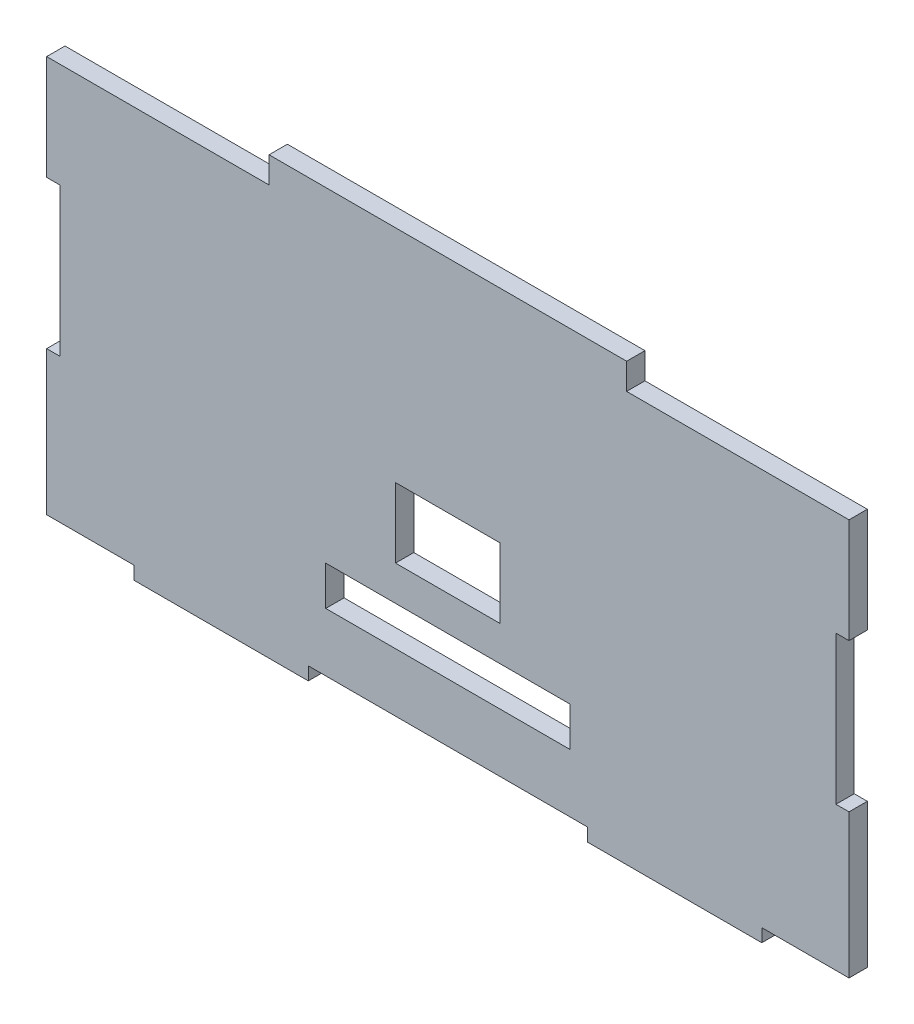
ISO-10303-21;
HEADER;
FILE_DESCRIPTION(('STEP AP214'),'2;1');
FILE_NAME('part.step','',(''),(''),'','','');
FILE_SCHEMA(('AUTOMOTIVE_DESIGN { 1 0 10303 214 1 1 1 1 }'));
ENDSEC;
DATA;
#1=APPLICATION_CONTEXT('core data for automotive mechanical design processes');
#2=APPLICATION_PROTOCOL_DEFINITION('international standard','automotive_design',2000,#1);
#3=PRODUCT_CONTEXT('',#1,'mechanical');
#4=PRODUCT('Part','Part','',(#3));
#5=PRODUCT_RELATED_PRODUCT_CATEGORY('part','',(#4));
#6=PRODUCT_DEFINITION_FORMATION('','',#4);
#7=PRODUCT_DEFINITION_CONTEXT('part definition',#1,'design');
#8=PRODUCT_DEFINITION('design','',#6,#7);
#9=PRODUCT_DEFINITION_SHAPE('','',#8);
#10=(LENGTH_UNIT() NAMED_UNIT(*) SI_UNIT(.MILLI.,.METRE.));
#11=(NAMED_UNIT(*) PLANE_ANGLE_UNIT() SI_UNIT($,.RADIAN.));
#12=(NAMED_UNIT(*) SI_UNIT($,.STERADIAN.) SOLID_ANGLE_UNIT());
#13=UNCERTAINTY_MEASURE_WITH_UNIT(LENGTH_MEASURE(1.E-05),#10,'distance_accuracy_value','');
#14=(GEOMETRIC_REPRESENTATION_CONTEXT(3) GLOBAL_UNCERTAINTY_ASSIGNED_CONTEXT((#13)) GLOBAL_UNIT_ASSIGNED_CONTEXT((#10,
#11,#12)) REPRESENTATION_CONTEXT('',''));
#15=CARTESIAN_POINT('',(0.,0.,0.));
#16=DIRECTION('',(0.,0.,1.));
#17=DIRECTION('',(1.,0.,0.));
#18=AXIS2_PLACEMENT_3D('',#15,#16,#17);
#19=CARTESIAN_POINT('',(46.,-23.5,-2.1));
#20=DIRECTION('',(1.,0.,0.));
#21=DIRECTION('',(0.,0.,-1.));
#22=AXIS2_PLACEMENT_3D('',#19,#20,#21);
#23=PLANE('',#22);
#24=DIRECTION('',(0.,0.,1.));
#25=VECTOR('',#24,1.);
#26=CARTESIAN_POINT('',(46.,-5.50000000000001,-2.1));
#27=LINE('',#26,#25);
#28=CARTESIAN_POINT('',(46.,-5.50000000000001,-2.1));
#29=VERTEX_POINT('',#28);
#30=CARTESIAN_POINT('',(46.,-5.50000000000001,0.));
#31=VERTEX_POINT('',#30);
#32=EDGE_CURVE('E502',#29,#31,#27,.T.);
#33=ORIENTED_EDGE('',*,*,#32,.T.);
#34=DIRECTION('',(0.,1.,0.));
#35=VECTOR('',#34,1.);
#36=CARTESIAN_POINT('',(46.,-23.5,0.));
#37=LINE('',#36,#35);
#38=CARTESIAN_POINT('',(46.,-22.,0.));
#39=VERTEX_POINT('',#38);
#40=EDGE_CURVE('E294',#39,#31,#37,.T.);
#41=ORIENTED_EDGE('',*,*,#40,.F.);
#42=DIRECTION('',(0.,0.,1.));
#43=VECTOR('',#42,1.);
#44=CARTESIAN_POINT('',(46.,-22.,-2.1));
#45=LINE('',#44,#43);
#46=CARTESIAN_POINT('',(46.,-22.,-2.1));
#47=VERTEX_POINT('',#46);
#48=EDGE_CURVE('E62',#47,#39,#45,.T.);
#49=ORIENTED_EDGE('',*,*,#48,.F.);
#50=DIRECTION('',(0.,1.,0.));
#51=VECTOR('',#50,1.);
#52=CARTESIAN_POINT('',(46.,-23.5,-2.1));
#53=LINE('',#52,#51);
#54=EDGE_CURVE('E305',#47,#29,#53,.T.);
#55=ORIENTED_EDGE('',*,*,#54,.T.);
#56=EDGE_LOOP('',(#33,#41,#49,#55));
#57=FACE_BOUND('',#56,.T.);
#58=ADVANCED_FACE('F37',(#57),#23,.T.);
#59=CARTESIAN_POINT('',(-46.,-23.5,-2.1));
#60=DIRECTION('',(0.,-1.,0.));
#61=DIRECTION('',(0.,0.,-1.));
#62=AXIS2_PLACEMENT_3D('',#59,#60,#61);
#63=PLANE('',#62);
#64=DIRECTION('',(0.,0.,1.));
#65=VECTOR('',#64,1.);
#66=CARTESIAN_POINT('',(-16.,-23.5,-2.1));
#67=LINE('',#66,#65);
#68=CARTESIAN_POINT('',(-16.,-23.5,-2.1));
#69=VERTEX_POINT('',#68);
#70=CARTESIAN_POINT('',(-16.,-23.5,0.));
#71=VERTEX_POINT('',#70);
#72=EDGE_CURVE('E454',#69,#71,#67,.T.);
#73=ORIENTED_EDGE('',*,*,#72,.T.);
#74=DIRECTION('',(1.,0.,0.));
#75=VECTOR('',#74,1.);
#76=CARTESIAN_POINT('',(-46.,-23.5,0.));
#77=LINE('',#76,#75);
#78=CARTESIAN_POINT('',(-36.,-23.5,0.));
#79=VERTEX_POINT('',#78);
#80=EDGE_CURVE('E292',#79,#71,#77,.T.);
#81=ORIENTED_EDGE('',*,*,#80,.F.);
#82=DIRECTION('',(0.,0.,1.));
#83=VECTOR('',#82,1.);
#84=CARTESIAN_POINT('',(-36.,-23.5,-2.1));
#85=LINE('',#84,#83);
#86=CARTESIAN_POINT('',(-36.,-23.5,-2.1));
#87=VERTEX_POINT('',#86);
#88=EDGE_CURVE('E456',#87,#79,#85,.T.);
#89=ORIENTED_EDGE('',*,*,#88,.F.);
#90=DIRECTION('',(1.,0.,0.));
#91=VECTOR('',#90,1.);
#92=CARTESIAN_POINT('',(-46.,-23.5,-2.1));
#93=LINE('',#92,#91);
#94=EDGE_CURVE('E315',#87,#69,#93,.T.);
#95=ORIENTED_EDGE('',*,*,#94,.T.);
#96=EDGE_LOOP('',(#73,#81,#89,#95));
#97=FACE_BOUND('',#96,.T.);
#98=ADVANCED_FACE('F452',(#97),#63,.T.);
#99=CARTESIAN_POINT('',(-46.,-23.5,-2.1));
#100=DIRECTION('',(-1.,0.,0.));
#101=DIRECTION('',(0.,0.,1.));
#102=AXIS2_PLACEMENT_3D('',#99,#100,#101);
#103=PLANE('',#102);
#104=DIRECTION('',(0.,0.,1.));
#105=VECTOR('',#104,1.);
#106=CARTESIAN_POINT('',(-46.,11.5,-2.1));
#107=LINE('',#106,#105);
#108=CARTESIAN_POINT('',(-46.,11.5,-2.1));
#109=VERTEX_POINT('',#108);
#110=CARTESIAN_POINT('',(-46.,11.5,0.));
#111=VERTEX_POINT('',#110);
#112=EDGE_CURVE('E348',#109,#111,#107,.T.);
#113=ORIENTED_EDGE('',*,*,#112,.T.);
#114=DIRECTION('',(0.,-1.,0.));
#115=VECTOR('',#114,1.);
#116=CARTESIAN_POINT('',(-46.,-23.5,0.));
#117=LINE('',#116,#115);
#118=CARTESIAN_POINT('',(-46.,23.5,0.));
#119=VERTEX_POINT('',#118);
#120=EDGE_CURVE('E280',#119,#111,#117,.T.);
#121=ORIENTED_EDGE('',*,*,#120,.F.);
#122=DIRECTION('',(0.,0.,1.));
#123=VECTOR('',#122,1.);
#124=CARTESIAN_POINT('',(-46.,23.5,-2.1));
#125=LINE('',#124,#123);
#126=CARTESIAN_POINT('',(-46.,23.5,-2.1));
#127=VERTEX_POINT('',#126);
#128=EDGE_CURVE('E46',#127,#119,#125,.T.);
#129=ORIENTED_EDGE('',*,*,#128,.F.);
#130=DIRECTION('',(0.,-1.,0.));
#131=VECTOR('',#130,1.);
#132=CARTESIAN_POINT('',(-46.,-23.5,-2.1));
#133=LINE('',#132,#131);
#134=EDGE_CURVE('E441',#127,#109,#133,.T.);
#135=ORIENTED_EDGE('',*,*,#134,.T.);
#136=EDGE_LOOP('',(#113,#121,#129,#135));
#137=FACE_BOUND('',#136,.T.);
#138=ADVANCED_FACE('F347',(#137),#103,.T.);
#139=CARTESIAN_POINT('',(20.5,23.5,-2.1));
#140=DIRECTION('',(0.,1.,0.));
#141=DIRECTION('',(-1.,0.,0.));
#142=AXIS2_PLACEMENT_3D('',#139,#140,#141);
#143=PLANE('',#142);
#144=DIRECTION('',(-1.,0.,0.));
#145=VECTOR('',#144,1.);
#146=CARTESIAN_POINT('',(20.5,23.5,0.));
#147=LINE('',#146,#145);
#148=CARTESIAN_POINT('',(46.,23.5,0.));
#149=VERTEX_POINT('',#148);
#150=CARTESIAN_POINT('',(20.5,23.5,0.));
#151=VERTEX_POINT('',#150);
#152=EDGE_CURVE('E320',#149,#151,#147,.T.);
#153=ORIENTED_EDGE('',*,*,#152,.F.);
#154=DIRECTION('',(0.,0.,1.));
#155=VECTOR('',#154,1.);
#156=CARTESIAN_POINT('',(46.,23.5,-2.1));
#157=LINE('',#156,#155);
#158=CARTESIAN_POINT('',(46.,23.5,-2.1));
#159=VERTEX_POINT('',#158);
#160=EDGE_CURVE('E11',#159,#149,#157,.T.);
#161=ORIENTED_EDGE('',*,*,#160,.F.);
#162=DIRECTION('',(-1.,0.,0.));
#163=VECTOR('',#162,1.);
#164=CARTESIAN_POINT('',(20.5,23.5,-2.1));
#165=LINE('',#164,#163);
#166=CARTESIAN_POINT('',(20.5,23.5,-2.1));
#167=VERTEX_POINT('',#166);
#168=EDGE_CURVE('E433',#159,#167,#165,.T.);
#169=ORIENTED_EDGE('',*,*,#168,.T.);
#170=DIRECTION('',(0.,0.,1.));
#171=VECTOR('',#170,1.);
#172=CARTESIAN_POINT('',(20.5,23.5,-2.1));
#173=LINE('',#172,#171);
#174=EDGE_CURVE('E41',#167,#151,#173,.T.);
#175=ORIENTED_EDGE('',*,*,#174,.T.);
#176=EDGE_LOOP('',(#153,#161,#169,#175));
#177=FACE_BOUND('',#176,.T.);
#178=ADVANCED_FACE('F39',(#177),#143,.T.);
#179=DIRECTION('',(0.,0.,1.));
#180=VECTOR('',#179,1.);
#181=CARTESIAN_POINT('',(46.,11.5,-2.1));
#182=LINE('',#181,#180);
#183=CARTESIAN_POINT('',(46.,11.5,-2.1));
#184=VERTEX_POINT('',#183);
#185=CARTESIAN_POINT('',(46.,11.5,0.));
#186=VERTEX_POINT('',#185);
#187=EDGE_CURVE('E54',#184,#186,#182,.T.);
#188=ORIENTED_EDGE('',*,*,#187,.F.);
#189=EDGE_CURVE('E310',#184,#159,#53,.T.);
#190=ORIENTED_EDGE('',*,*,#189,.T.);
#191=ORIENTED_EDGE('',*,*,#160,.T.);
#192=EDGE_CURVE('E293',#186,#149,#37,.T.);
#193=ORIENTED_EDGE('',*,*,#192,.F.);
#194=EDGE_LOOP('',(#188,#190,#191,#193));
#195=FACE_BOUND('',#194,.T.);
#196=ADVANCED_FACE('F565',(#195),#23,.T.);
#197=DIRECTION('',(0.,0.,1.));
#198=VECTOR('',#197,1.);
#199=CARTESIAN_POINT('',(36.,-23.5,-2.1));
#200=LINE('',#199,#198);
#201=CARTESIAN_POINT('',(36.,-23.5,-2.1));
#202=VERTEX_POINT('',#201);
#203=CARTESIAN_POINT('',(36.,-23.5,0.));
#204=VERTEX_POINT('',#203);
#205=EDGE_CURVE('E484',#202,#204,#200,.T.);
#206=ORIENTED_EDGE('',*,*,#205,.T.);
#207=CARTESIAN_POINT('',(16.,-23.5,0.));
#208=VERTEX_POINT('',#207);
#209=EDGE_CURVE('E284',#208,#204,#77,.T.);
#210=ORIENTED_EDGE('',*,*,#209,.F.);
#211=DIRECTION('',(0.,0.,1.));
#212=VECTOR('',#211,1.);
#213=CARTESIAN_POINT('',(16.,-23.5,-2.1));
#214=LINE('',#213,#212);
#215=CARTESIAN_POINT('',(16.,-23.5,-2.1));
#216=VERTEX_POINT('',#215);
#217=EDGE_CURVE('E469',#216,#208,#214,.T.);
#218=ORIENTED_EDGE('',*,*,#217,.F.);
#219=EDGE_CURVE('E318',#216,#202,#93,.T.);
#220=ORIENTED_EDGE('',*,*,#219,.T.);
#221=EDGE_LOOP('',(#206,#210,#218,#220));
#222=FACE_BOUND('',#221,.T.);
#223=ADVANCED_FACE('F543',(#222),#63,.T.);
#224=DIRECTION('',(0.,0.,1.));
#225=VECTOR('',#224,1.);
#226=CARTESIAN_POINT('',(-46.,-22.,-2.1));
#227=LINE('',#226,#225);
#228=CARTESIAN_POINT('',(-46.,-22.,-2.1));
#229=VERTEX_POINT('',#228);
#230=CARTESIAN_POINT('',(-46.,-22.,0.));
#231=VERTEX_POINT('',#230);
#232=EDGE_CURVE('E253',#229,#231,#227,.T.);
#233=ORIENTED_EDGE('',*,*,#232,.T.);
#234=CARTESIAN_POINT('',(-46.,-5.50000000000001,0.));
#235=VERTEX_POINT('',#234);
#236=EDGE_CURVE('E268',#235,#231,#117,.T.);
#237=ORIENTED_EDGE('',*,*,#236,.F.);
#238=DIRECTION('',(0.,0.,1.));
#239=VECTOR('',#238,1.);
#240=CARTESIAN_POINT('',(-46.,-5.50000000000001,-2.1));
#241=LINE('',#240,#239);
#242=CARTESIAN_POINT('',(-46.,-5.50000000000001,-2.1));
#243=VERTEX_POINT('',#242);
#244=EDGE_CURVE('E368',#243,#235,#241,.T.);
#245=ORIENTED_EDGE('',*,*,#244,.F.);
#246=EDGE_CURVE('E270',#243,#229,#133,.T.);
#247=ORIENTED_EDGE('',*,*,#246,.T.);
#248=EDGE_LOOP('',(#233,#237,#245,#247));
#249=FACE_BOUND('',#248,.T.);
#250=ADVANCED_FACE('F266',(#249),#103,.T.);
#251=CARTESIAN_POINT('',(-46.,23.5,-2.1));
#252=DIRECTION('',(0.,1.,0.));
#253=DIRECTION('',(0.,0.,1.));
#254=AXIS2_PLACEMENT_3D('',#251,#252,#253);
#255=PLANE('',#254);
#256=DIRECTION('',(-1.,0.,0.));
#257=VECTOR('',#256,1.);
#258=CARTESIAN_POINT('',(-46.,23.5,0.));
#259=LINE('',#258,#257);
#260=CARTESIAN_POINT('',(-20.5,23.5,0.));
#261=VERTEX_POINT('',#260);
#262=EDGE_CURVE('E281',#261,#119,#259,.T.);
#263=ORIENTED_EDGE('',*,*,#262,.F.);
#264=DIRECTION('',(0.,0.,1.));
#265=VECTOR('',#264,1.);
#266=CARTESIAN_POINT('',(-20.5,23.5,-2.1));
#267=LINE('',#266,#265);
#268=CARTESIAN_POINT('',(-20.5,23.5,-2.1));
#269=VERTEX_POINT('',#268);
#270=EDGE_CURVE('E297',#269,#261,#267,.T.);
#271=ORIENTED_EDGE('',*,*,#270,.F.);
#272=DIRECTION('',(-1.,0.,0.));
#273=VECTOR('',#272,1.);
#274=CARTESIAN_POINT('',(-46.,23.5,-2.1));
#275=LINE('',#274,#273);
#276=EDGE_CURVE('E342',#269,#127,#275,.T.);
#277=ORIENTED_EDGE('',*,*,#276,.T.);
#278=ORIENTED_EDGE('',*,*,#128,.T.);
#279=EDGE_LOOP('',(#263,#271,#277,#278));
#280=FACE_BOUND('',#279,.T.);
#281=ADVANCED_FACE('F340',(#280),#255,.T.);
#282=CARTESIAN_POINT('',(-20.5,23.5,-2.1));
#283=DIRECTION('',(-1.,0.,0.));
#284=DIRECTION('',(0.,0.,1.));
#285=AXIS2_PLACEMENT_3D('',#282,#283,#284);
#286=PLANE('',#285);
#287=DIRECTION('',(0.,-1.,0.));
#288=VECTOR('',#287,1.);
#289=CARTESIAN_POINT('',(-20.5,23.5,0.));
#290=LINE('',#289,#288);
#291=CARTESIAN_POINT('',(-20.5,26.5,0.));
#292=VERTEX_POINT('',#291);
#293=EDGE_CURVE('E286',#292,#261,#290,.T.);
#294=ORIENTED_EDGE('',*,*,#293,.F.);
#295=DIRECTION('',(0.,0.,1.));
#296=VECTOR('',#295,1.);
#297=CARTESIAN_POINT('',(-20.5,26.5,-2.1));
#298=LINE('',#297,#296);
#299=CARTESIAN_POINT('',(-20.5,26.5,-2.1));
#300=VERTEX_POINT('',#299);
#301=EDGE_CURVE('E299',#300,#292,#298,.T.);
#302=ORIENTED_EDGE('',*,*,#301,.F.);
#303=DIRECTION('',(0.,-1.,0.));
#304=VECTOR('',#303,1.);
#305=CARTESIAN_POINT('',(-20.5,23.5,-2.1));
#306=LINE('',#305,#304);
#307=EDGE_CURVE('E336',#300,#269,#306,.T.);
#308=ORIENTED_EDGE('',*,*,#307,.T.);
#309=ORIENTED_EDGE('',*,*,#270,.T.);
#310=EDGE_LOOP('',(#294,#302,#308,#309));
#311=FACE_BOUND('',#310,.T.);
#312=ADVANCED_FACE('F333',(#311),#286,.T.);
#313=CARTESIAN_POINT('',(-20.5,26.5,-2.1));
#314=DIRECTION('',(0.,1.,0.));
#315=DIRECTION('',(0.,0.,1.));
#316=AXIS2_PLACEMENT_3D('',#313,#314,#315);
#317=PLANE('',#316);
#318=DIRECTION('',(-1.,0.,0.));
#319=VECTOR('',#318,1.);
#320=CARTESIAN_POINT('',(-20.5,26.5,0.));
#321=LINE('',#320,#319);
#322=CARTESIAN_POINT('',(20.5,26.5,0.));
#323=VERTEX_POINT('',#322);
#324=EDGE_CURVE('E327',#323,#292,#321,.T.);
#325=ORIENTED_EDGE('',*,*,#324,.F.);
#326=DIRECTION('',(0.,0.,1.));
#327=VECTOR('',#326,1.);
#328=CARTESIAN_POINT('',(20.5,26.5,-2.1));
#329=LINE('',#328,#327);
#330=CARTESIAN_POINT('',(20.5,26.5,-2.1));
#331=VERTEX_POINT('',#330);
#332=EDGE_CURVE('E300',#331,#323,#329,.T.);
#333=ORIENTED_EDGE('',*,*,#332,.F.);
#334=DIRECTION('',(-1.,0.,0.));
#335=VECTOR('',#334,1.);
#336=CARTESIAN_POINT('',(-20.5,26.5,-2.1));
#337=LINE('',#336,#335);
#338=EDGE_CURVE('E437',#331,#300,#337,.T.);
#339=ORIENTED_EDGE('',*,*,#338,.T.);
#340=ORIENTED_EDGE('',*,*,#301,.T.);
#341=EDGE_LOOP('',(#325,#333,#339,#340));
#342=FACE_BOUND('',#341,.T.);
#343=ADVANCED_FACE('F858',(#342),#317,.T.);
#344=CARTESIAN_POINT('',(20.5,26.5,-2.1));
#345=DIRECTION('',(1.,0.,0.));
#346=DIRECTION('',(0.,0.,-1.));
#347=AXIS2_PLACEMENT_3D('',#344,#345,#346);
#348=PLANE('',#347);
#349=DIRECTION('',(0.,1.,0.));
#350=VECTOR('',#349,1.);
#351=CARTESIAN_POINT('',(20.5,26.5,0.));
#352=LINE('',#351,#350);
#353=EDGE_CURVE('E323',#151,#323,#352,.T.);
#354=ORIENTED_EDGE('',*,*,#353,.F.);
#355=ORIENTED_EDGE('',*,*,#174,.F.);
#356=DIRECTION('',(0.,1.,0.));
#357=VECTOR('',#356,1.);
#358=CARTESIAN_POINT('',(20.5,26.5,-2.1));
#359=LINE('',#358,#357);
#360=EDGE_CURVE('E435',#167,#331,#359,.T.);
#361=ORIENTED_EDGE('',*,*,#360,.T.);
#362=ORIENTED_EDGE('',*,*,#332,.T.);
#363=EDGE_LOOP('',(#354,#355,#361,#362));
#364=FACE_BOUND('',#363,.T.);
#365=ADVANCED_FACE('F638',(#364),#348,.T.);
#366=CARTESIAN_POINT('',(0.,0.,-2.1));
#367=DIRECTION('',(0.,0.,1.));
#368=DIRECTION('',(1.,0.,0.));
#369=AXIS2_PLACEMENT_3D('',#366,#367,#368);
#370=PLANE('',#369);
#371=DIRECTION('',(1.,0.,0.));
#372=VECTOR('',#371,1.);
#373=CARTESIAN_POINT('',(-14.,-15.3,-2.1));
#374=LINE('',#373,#372);
#375=CARTESIAN_POINT('',(-14.,-15.3,-2.1));
#376=VERTEX_POINT('',#375);
#377=CARTESIAN_POINT('',(14.,-15.3,-2.1));
#378=VERTEX_POINT('',#377);
#379=EDGE_CURVE('E381',#376,#378,#374,.T.);
#380=ORIENTED_EDGE('',*,*,#379,.T.);
#381=DIRECTION('',(0.,1.,0.));
#382=VECTOR('',#381,1.);
#383=CARTESIAN_POINT('',(14.,-15.3,-2.1));
#384=LINE('',#383,#382);
#385=CARTESIAN_POINT('',(14.,-10.8,-2.1));
#386=VERTEX_POINT('',#385);
#387=EDGE_CURVE('E371',#378,#386,#384,.T.);
#388=ORIENTED_EDGE('',*,*,#387,.T.);
#389=DIRECTION('',(-1.,0.,0.));
#390=VECTOR('',#389,1.);
#391=CARTESIAN_POINT('',(-14.,-10.8,-2.1));
#392=LINE('',#391,#390);
#393=CARTESIAN_POINT('',(-14.,-10.8,-2.1));
#394=VERTEX_POINT('',#393);
#395=EDGE_CURVE('E374',#386,#394,#392,.T.);
#396=ORIENTED_EDGE('',*,*,#395,.T.);
#397=DIRECTION('',(0.,-1.,0.));
#398=VECTOR('',#397,1.);
#399=CARTESIAN_POINT('',(-14.,-15.3,-2.1));
#400=LINE('',#399,#398);
#401=EDGE_CURVE('E378',#394,#376,#400,.T.);
#402=ORIENTED_EDGE('',*,*,#401,.T.);
#403=EDGE_LOOP('',(#380,#388,#396,#402));
#404=FACE_BOUND('',#403,.T.);
#405=DIRECTION('',(1.,0.,0.));
#406=VECTOR('',#405,1.);
#407=CARTESIAN_POINT('',(-6.00000000000001,-6.8,-2.1));
#408=LINE('',#407,#406);
#409=CARTESIAN_POINT('',(-6.00000000000001,-6.8,-2.1));
#410=VERTEX_POINT('',#409);
#411=CARTESIAN_POINT('',(6.,-6.8,-2.1));
#412=VERTEX_POINT('',#411);
#413=EDGE_CURVE('E406',#410,#412,#408,.T.);
#414=ORIENTED_EDGE('',*,*,#413,.T.);
#415=DIRECTION('',(0.,1.,0.));
#416=VECTOR('',#415,1.);
#417=CARTESIAN_POINT('',(6.,-6.8,-2.1));
#418=LINE('',#417,#416);
#419=CARTESIAN_POINT('',(6.,1.2,-2.1));
#420=VERTEX_POINT('',#419);
#421=EDGE_CURVE('E416',#412,#420,#418,.T.);
#422=ORIENTED_EDGE('',*,*,#421,.T.);
#423=DIRECTION('',(-1.,0.,0.));
#424=VECTOR('',#423,1.);
#425=CARTESIAN_POINT('',(-6.00000000000001,1.2,-2.1));
#426=LINE('',#425,#424);
#427=CARTESIAN_POINT('',(-6.00000000000001,1.2,-2.1));
#428=VERTEX_POINT('',#427);
#429=EDGE_CURVE('E428',#420,#428,#426,.T.);
#430=ORIENTED_EDGE('',*,*,#429,.T.);
#431=DIRECTION('',(0.,-1.,0.));
#432=VECTOR('',#431,1.);
#433=CARTESIAN_POINT('',(-6.00000000000001,-6.8,-2.1));
#434=LINE('',#433,#432);
#435=EDGE_CURVE('E425',#428,#410,#434,.T.);
#436=ORIENTED_EDGE('',*,*,#435,.T.);
#437=EDGE_LOOP('',(#414,#422,#430,#436));
#438=FACE_BOUND('',#437,.T.);
#439=DIRECTION('',(0.,-1.,0.));
#440=VECTOR('',#439,1.);
#441=CARTESIAN_POINT('',(44.5,11.5,-2.1));
#442=LINE('',#441,#440);
#443=CARTESIAN_POINT('',(44.5,11.5,-2.1));
#444=VERTEX_POINT('',#443);
#445=CARTESIAN_POINT('',(44.5,-5.50000000000001,-2.1));
#446=VERTEX_POINT('',#445);
#447=EDGE_CURVE('E513',#444,#446,#442,.T.);
#448=ORIENTED_EDGE('',*,*,#447,.T.);
#449=DIRECTION('',(1.,0.,0.));
#450=VECTOR('',#449,1.);
#451=CARTESIAN_POINT('',(44.5,-5.50000000000001,-2.1));
#452=LINE('',#451,#450);
#453=EDGE_CURVE('E497',#446,#29,#452,.T.);
#454=ORIENTED_EDGE('',*,*,#453,.T.);
#455=ORIENTED_EDGE('',*,*,#54,.F.);
#456=DIRECTION('',(-1.,0.,0.));
#457=VECTOR('',#456,1.);
#458=CARTESIAN_POINT('',(36.,-22.,-2.1));
#459=LINE('',#458,#457);
#460=CARTESIAN_POINT('',(36.,-22.,-2.1));
#461=VERTEX_POINT('',#460);
#462=EDGE_CURVE('E490',#47,#461,#459,.T.);
#463=ORIENTED_EDGE('',*,*,#462,.T.);
#464=DIRECTION('',(0.,-1.,0.));
#465=VECTOR('',#464,1.);
#466=CARTESIAN_POINT('',(36.,-23.5,-2.1));
#467=LINE('',#466,#465);
#468=EDGE_CURVE('E481',#461,#202,#467,.T.);
#469=ORIENTED_EDGE('',*,*,#468,.T.);
#470=ORIENTED_EDGE('',*,*,#219,.F.);
#471=DIRECTION('',(0.,1.,0.));
#472=VECTOR('',#471,1.);
#473=CARTESIAN_POINT('',(16.,-22.,-2.1));
#474=LINE('',#473,#472);
#475=CARTESIAN_POINT('',(16.,-22.,-2.1));
#476=VERTEX_POINT('',#475);
#477=EDGE_CURVE('E471',#216,#476,#474,.T.);
#478=ORIENTED_EDGE('',*,*,#477,.T.);
#479=DIRECTION('',(-1.,0.,0.));
#480=VECTOR('',#479,1.);
#481=CARTESIAN_POINT('',(-16.,-22.,-2.1));
#482=LINE('',#481,#480);
#483=CARTESIAN_POINT('',(-16.,-22.,-2.1));
#484=VERTEX_POINT('',#483);
#485=EDGE_CURVE('E467',#476,#484,#482,.T.);
#486=ORIENTED_EDGE('',*,*,#485,.T.);
#487=DIRECTION('',(0.,-1.,0.));
#488=VECTOR('',#487,1.);
#489=CARTESIAN_POINT('',(-16.,-23.5,-2.1));
#490=LINE('',#489,#488);
#491=EDGE_CURVE('E464',#484,#69,#490,.T.);
#492=ORIENTED_EDGE('',*,*,#491,.T.);
#493=ORIENTED_EDGE('',*,*,#94,.F.);
#494=DIRECTION('',(0.,1.,0.));
#495=VECTOR('',#494,1.);
#496=CARTESIAN_POINT('',(-36.,-22.,-2.1));
#497=LINE('',#496,#495);
#498=CARTESIAN_POINT('',(-36.,-22.,-2.1));
#499=VERTEX_POINT('',#498);
#500=EDGE_CURVE('E261',#87,#499,#497,.T.);
#501=ORIENTED_EDGE('',*,*,#500,.T.);
#502=DIRECTION('',(-1.,0.,0.));
#503=VECTOR('',#502,1.);
#504=CARTESIAN_POINT('',(-46.,-22.,-2.1));
#505=LINE('',#504,#503);
#506=EDGE_CURVE('E524',#499,#229,#505,.T.);
#507=ORIENTED_EDGE('',*,*,#506,.T.);
#508=ORIENTED_EDGE('',*,*,#246,.F.);
#509=DIRECTION('',(1.,0.,0.));
#510=VECTOR('',#509,1.);
#511=CARTESIAN_POINT('',(-44.5,-5.50000000000001,-2.1));
#512=LINE('',#511,#510);
#513=CARTESIAN_POINT('',(-44.5,-5.50000000000001,-2.1));
#514=VERTEX_POINT('',#513);
#515=EDGE_CURVE('E354',#243,#514,#512,.T.);
#516=ORIENTED_EDGE('',*,*,#515,.T.);
#517=DIRECTION('',(0.,1.,0.));
#518=VECTOR('',#517,1.);
#519=CARTESIAN_POINT('',(-44.5,11.5,-2.1));
#520=LINE('',#519,#518);
#521=CARTESIAN_POINT('',(-44.5,11.5,-2.1));
#522=VERTEX_POINT('',#521);
#523=EDGE_CURVE('E357',#514,#522,#520,.T.);
#524=ORIENTED_EDGE('',*,*,#523,.T.);
#525=DIRECTION('',(-1.,0.,0.));
#526=VECTOR('',#525,1.);
#527=CARTESIAN_POINT('',(-46.,11.5,-2.1));
#528=LINE('',#527,#526);
#529=EDGE_CURVE('E370',#522,#109,#528,.T.);
#530=ORIENTED_EDGE('',*,*,#529,.T.);
#531=ORIENTED_EDGE('',*,*,#134,.F.);
#532=ORIENTED_EDGE('',*,*,#276,.F.);
#533=ORIENTED_EDGE('',*,*,#307,.F.);
#534=ORIENTED_EDGE('',*,*,#338,.F.);
#535=ORIENTED_EDGE('',*,*,#360,.F.);
#536=ORIENTED_EDGE('',*,*,#168,.F.);
#537=ORIENTED_EDGE('',*,*,#189,.F.);
#538=DIRECTION('',(-1.,0.,0.));
#539=VECTOR('',#538,1.);
#540=CARTESIAN_POINT('',(46.,11.5,-2.1));
#541=LINE('',#540,#539);
#542=EDGE_CURVE('E507',#184,#444,#541,.T.);
#543=ORIENTED_EDGE('',*,*,#542,.T.);
#544=EDGE_LOOP('',(#448,#454,#455,#463,#469,#470,#478,#486,#492,#493,#501,#507,#508,#516,#524,
#530,#531,#532,#533,#534,#535,#536,#537,#543));
#545=FACE_BOUND('',#544,.T.);
#546=ADVANCED_FACE('F461',(#404,#438,#545),#370,.F.);
#547=CARTESIAN_POINT('',(0.,0.,0.));
#548=DIRECTION('',(0.,0.,1.));
#549=DIRECTION('',(1.,0.,0.));
#550=AXIS2_PLACEMENT_3D('',#547,#548,#549);
#551=PLANE('',#550);
#552=DIRECTION('',(1.,0.,0.));
#553=VECTOR('',#552,1.);
#554=CARTESIAN_POINT('',(44.5,-5.50000000000001,0.));
#555=LINE('',#554,#553);
#556=CARTESIAN_POINT('',(44.5,-5.50000000000001,0.));
#557=VERTEX_POINT('',#556);
#558=EDGE_CURVE('E504',#557,#31,#555,.T.);
#559=ORIENTED_EDGE('',*,*,#558,.F.);
#560=DIRECTION('',(0.,-1.,0.));
#561=VECTOR('',#560,1.);
#562=CARTESIAN_POINT('',(44.5,11.5,0.));
#563=LINE('',#562,#561);
#564=CARTESIAN_POINT('',(44.5,11.5,0.));
#565=VERTEX_POINT('',#564);
#566=EDGE_CURVE('E506',#565,#557,#563,.T.);
#567=ORIENTED_EDGE('',*,*,#566,.F.);
#568=DIRECTION('',(-1.,0.,0.));
#569=VECTOR('',#568,1.);
#570=CARTESIAN_POINT('',(46.,11.5,0.));
#571=LINE('',#570,#569);
#572=EDGE_CURVE('E486',#186,#565,#571,.T.);
#573=ORIENTED_EDGE('',*,*,#572,.F.);
#574=ORIENTED_EDGE('',*,*,#192,.T.);
#575=ORIENTED_EDGE('',*,*,#152,.T.);
#576=ORIENTED_EDGE('',*,*,#353,.T.);
#577=ORIENTED_EDGE('',*,*,#324,.T.);
#578=ORIENTED_EDGE('',*,*,#293,.T.);
#579=ORIENTED_EDGE('',*,*,#262,.T.);
#580=ORIENTED_EDGE('',*,*,#120,.T.);
#581=DIRECTION('',(-1.,0.,0.));
#582=VECTOR('',#581,1.);
#583=CARTESIAN_POINT('',(-46.,11.5,0.));
#584=LINE('',#583,#582);
#585=CARTESIAN_POINT('',(-44.5,11.5,0.));
#586=VERTEX_POINT('',#585);
#587=EDGE_CURVE('E350',#586,#111,#584,.T.);
#588=ORIENTED_EDGE('',*,*,#587,.F.);
#589=DIRECTION('',(0.,1.,0.));
#590=VECTOR('',#589,1.);
#591=CARTESIAN_POINT('',(-44.5,11.5,0.));
#592=LINE('',#591,#590);
#593=CARTESIAN_POINT('',(-44.5,-5.50000000000001,0.));
#594=VERTEX_POINT('',#593);
#595=EDGE_CURVE('E352',#594,#586,#592,.T.);
#596=ORIENTED_EDGE('',*,*,#595,.F.);
#597=DIRECTION('',(1.,0.,0.));
#598=VECTOR('',#597,1.);
#599=CARTESIAN_POINT('',(-44.5,-5.50000000000001,0.));
#600=LINE('',#599,#598);
#601=EDGE_CURVE('E279',#235,#594,#600,.T.);
#602=ORIENTED_EDGE('',*,*,#601,.F.);
#603=ORIENTED_EDGE('',*,*,#236,.T.);
#604=DIRECTION('',(-1.,0.,0.));
#605=VECTOR('',#604,1.);
#606=CARTESIAN_POINT('',(-46.,-22.,0.));
#607=LINE('',#606,#605);
#608=CARTESIAN_POINT('',(-36.,-22.,0.));
#609=VERTEX_POINT('',#608);
#610=EDGE_CURVE('E249',#609,#231,#607,.T.);
#611=ORIENTED_EDGE('',*,*,#610,.F.);
#612=DIRECTION('',(0.,1.,0.));
#613=VECTOR('',#612,1.);
#614=CARTESIAN_POINT('',(-36.,-22.,0.));
#615=LINE('',#614,#613);
#616=EDGE_CURVE('E260',#79,#609,#615,.T.);
#617=ORIENTED_EDGE('',*,*,#616,.F.);
#618=ORIENTED_EDGE('',*,*,#80,.T.);
#619=DIRECTION('',(0.,-1.,0.));
#620=VECTOR('',#619,1.);
#621=CARTESIAN_POINT('',(-16.,-23.5,0.));
#622=LINE('',#621,#620);
#623=CARTESIAN_POINT('',(-16.,-22.,0.));
#624=VERTEX_POINT('',#623);
#625=EDGE_CURVE('E479',#624,#71,#622,.T.);
#626=ORIENTED_EDGE('',*,*,#625,.F.);
#627=DIRECTION('',(-1.,0.,0.));
#628=VECTOR('',#627,1.);
#629=CARTESIAN_POINT('',(-16.,-22.,0.));
#630=LINE('',#629,#628);
#631=CARTESIAN_POINT('',(16.,-22.,0.));
#632=VERTEX_POINT('',#631);
#633=EDGE_CURVE('E531',#632,#624,#630,.T.);
#634=ORIENTED_EDGE('',*,*,#633,.F.);
#635=DIRECTION('',(0.,1.,0.));
#636=VECTOR('',#635,1.);
#637=CARTESIAN_POINT('',(16.,-22.,0.));
#638=LINE('',#637,#636);
#639=EDGE_CURVE('E271',#208,#632,#638,.T.);
#640=ORIENTED_EDGE('',*,*,#639,.F.);
#641=ORIENTED_EDGE('',*,*,#209,.T.);
#642=DIRECTION('',(0.,-1.,0.));
#643=VECTOR('',#642,1.);
#644=CARTESIAN_POINT('',(36.,-23.5,0.));
#645=LINE('',#644,#643);
#646=CARTESIAN_POINT('',(36.,-22.,0.));
#647=VERTEX_POINT('',#646);
#648=EDGE_CURVE('E487',#647,#204,#645,.T.);
#649=ORIENTED_EDGE('',*,*,#648,.F.);
#650=DIRECTION('',(-1.,0.,0.));
#651=VECTOR('',#650,1.);
#652=CARTESIAN_POINT('',(36.,-22.,0.));
#653=LINE('',#652,#651);
#654=EDGE_CURVE('E489',#39,#647,#653,.T.);
#655=ORIENTED_EDGE('',*,*,#654,.F.);
#656=ORIENTED_EDGE('',*,*,#40,.T.);
#657=EDGE_LOOP('',(#559,#567,#573,#574,#575,#576,#577,#578,#579,#580,#588,#596,#602,#603,#611,
#617,#618,#626,#634,#640,#641,#649,#655,#656));
#658=FACE_BOUND('',#657,.T.);
#659=DIRECTION('',(0.,1.,0.));
#660=VECTOR('',#659,1.);
#661=CARTESIAN_POINT('',(14.,-15.3,0.));
#662=LINE('',#661,#660);
#663=CARTESIAN_POINT('',(14.,-15.3,0.));
#664=VERTEX_POINT('',#663);
#665=CARTESIAN_POINT('',(14.,-10.8,0.));
#666=VERTEX_POINT('',#665);
#667=EDGE_CURVE('E385',#664,#666,#662,.T.);
#668=ORIENTED_EDGE('',*,*,#667,.F.);
#669=DIRECTION('',(1.,0.,0.));
#670=VECTOR('',#669,1.);
#671=CARTESIAN_POINT('',(-14.,-15.3,0.));
#672=LINE('',#671,#670);
#673=CARTESIAN_POINT('',(-14.,-15.3,0.));
#674=VERTEX_POINT('',#673);
#675=EDGE_CURVE('E375',#674,#664,#672,.T.);
#676=ORIENTED_EDGE('',*,*,#675,.F.);
#677=DIRECTION('',(0.,-1.,0.));
#678=VECTOR('',#677,1.);
#679=CARTESIAN_POINT('',(-14.,-15.3,0.));
#680=LINE('',#679,#678);
#681=CARTESIAN_POINT('',(-14.,-10.8,0.));
#682=VERTEX_POINT('',#681);
#683=EDGE_CURVE('E391',#682,#674,#680,.T.);
#684=ORIENTED_EDGE('',*,*,#683,.F.);
#685=DIRECTION('',(-1.,0.,0.));
#686=VECTOR('',#685,1.);
#687=CARTESIAN_POINT('',(-14.,-10.8,0.));
#688=LINE('',#687,#686);
#689=EDGE_CURVE('E387',#666,#682,#688,.T.);
#690=ORIENTED_EDGE('',*,*,#689,.F.);
#691=EDGE_LOOP('',(#668,#676,#684,#690));
#692=FACE_BOUND('',#691,.T.);
#693=DIRECTION('',(0.,1.,0.));
#694=VECTOR('',#693,1.);
#695=CARTESIAN_POINT('',(6.,-6.8,0.));
#696=LINE('',#695,#694);
#697=CARTESIAN_POINT('',(6.,-6.8,0.));
#698=VERTEX_POINT('',#697);
#699=CARTESIAN_POINT('',(6.,1.2,0.));
#700=VERTEX_POINT('',#699);
#701=EDGE_CURVE('E388',#698,#700,#696,.T.);
#702=ORIENTED_EDGE('',*,*,#701,.F.);
#703=DIRECTION('',(1.,0.,0.));
#704=VECTOR('',#703,1.);
#705=CARTESIAN_POINT('',(-6.00000000000001,-6.8,0.));
#706=LINE('',#705,#704);
#707=CARTESIAN_POINT('',(-6.00000000000001,-6.8,0.));
#708=VERTEX_POINT('',#707);
#709=EDGE_CURVE('E412',#708,#698,#706,.T.);
#710=ORIENTED_EDGE('',*,*,#709,.F.);
#711=DIRECTION('',(0.,-1.,0.));
#712=VECTOR('',#711,1.);
#713=CARTESIAN_POINT('',(-6.00000000000001,-6.8,0.));
#714=LINE('',#713,#712);
#715=CARTESIAN_POINT('',(-6.00000000000001,1.2,0.));
#716=VERTEX_POINT('',#715);
#717=EDGE_CURVE('E415',#716,#708,#714,.T.);
#718=ORIENTED_EDGE('',*,*,#717,.F.);
#719=DIRECTION('',(-1.,0.,0.));
#720=VECTOR('',#719,1.);
#721=CARTESIAN_POINT('',(-6.00000000000001,1.2,0.));
#722=LINE('',#721,#720);
#723=EDGE_CURVE('E419',#700,#716,#722,.T.);
#724=ORIENTED_EDGE('',*,*,#723,.F.);
#725=EDGE_LOOP('',(#702,#710,#718,#724));
#726=FACE_BOUND('',#725,.T.);
#727=ADVANCED_FACE('F275',(#658,#692,#726),#551,.T.);
#728=CARTESIAN_POINT('',(6.,-6.8,-2.1));
#729=DIRECTION('',(1.,0.,0.));
#730=DIRECTION('',(0.,0.,-1.));
#731=AXIS2_PLACEMENT_3D('',#728,#729,#730);
#732=PLANE('',#731);
#733=ORIENTED_EDGE('',*,*,#701,.T.);
#734=DIRECTION('',(0.,0.,1.));
#735=VECTOR('',#734,1.);
#736=CARTESIAN_POINT('',(6.,1.2,-2.1));
#737=LINE('',#736,#735);
#738=EDGE_CURVE('E403',#420,#700,#737,.T.);
#739=ORIENTED_EDGE('',*,*,#738,.F.);
#740=ORIENTED_EDGE('',*,*,#421,.F.);
#741=DIRECTION('',(0.,0.,1.));
#742=VECTOR('',#741,1.);
#743=CARTESIAN_POINT('',(6.,-6.8,-2.1));
#744=LINE('',#743,#742);
#745=EDGE_CURVE('E363',#412,#698,#744,.T.);
#746=ORIENTED_EDGE('',*,*,#745,.T.);
#747=EDGE_LOOP('',(#733,#739,#740,#746));
#748=FACE_BOUND('',#747,.T.);
#749=ADVANCED_FACE('F622',(#748),#732,.F.);
#750=CARTESIAN_POINT('',(-6.00000000000001,-6.8,-2.1));
#751=DIRECTION('',(0.,-1.,0.));
#752=DIRECTION('',(0.,0.,-1.));
#753=AXIS2_PLACEMENT_3D('',#750,#751,#752);
#754=PLANE('',#753);
#755=ORIENTED_EDGE('',*,*,#709,.T.);
#756=ORIENTED_EDGE('',*,*,#745,.F.);
#757=ORIENTED_EDGE('',*,*,#413,.F.);
#758=DIRECTION('',(0.,0.,1.));
#759=VECTOR('',#758,1.);
#760=CARTESIAN_POINT('',(-6.00000000000001,-6.8,-2.1));
#761=LINE('',#760,#759);
#762=EDGE_CURVE('E409',#410,#708,#761,.T.);
#763=ORIENTED_EDGE('',*,*,#762,.T.);
#764=EDGE_LOOP('',(#755,#756,#757,#763));
#765=FACE_BOUND('',#764,.T.);
#766=ADVANCED_FACE('F625',(#765),#754,.F.);
#767=CARTESIAN_POINT('',(-6.00000000000001,-6.8,-2.1));
#768=DIRECTION('',(-1.,0.,0.));
#769=DIRECTION('',(0.,0.,1.));
#770=AXIS2_PLACEMENT_3D('',#767,#768,#769);
#771=PLANE('',#770);
#772=ORIENTED_EDGE('',*,*,#717,.T.);
#773=ORIENTED_EDGE('',*,*,#762,.F.);
#774=ORIENTED_EDGE('',*,*,#435,.F.);
#775=DIRECTION('',(0.,0.,1.));
#776=VECTOR('',#775,1.);
#777=CARTESIAN_POINT('',(-6.00000000000001,1.2,-2.1));
#778=LINE('',#777,#776);
#779=EDGE_CURVE('E407',#428,#716,#778,.T.);
#780=ORIENTED_EDGE('',*,*,#779,.T.);
#781=EDGE_LOOP('',(#772,#773,#774,#780));
#782=FACE_BOUND('',#781,.T.);
#783=ADVANCED_FACE('F629',(#782),#771,.F.);
#784=CARTESIAN_POINT('',(-6.00000000000001,1.2,-2.1));
#785=DIRECTION('',(0.,1.,0.));
#786=DIRECTION('',(0.,0.,1.));
#787=AXIS2_PLACEMENT_3D('',#784,#785,#786);
#788=PLANE('',#787);
#789=ORIENTED_EDGE('',*,*,#723,.T.);
#790=ORIENTED_EDGE('',*,*,#779,.F.);
#791=ORIENTED_EDGE('',*,*,#429,.F.);
#792=ORIENTED_EDGE('',*,*,#738,.T.);
#793=EDGE_LOOP('',(#789,#790,#791,#792));
#794=FACE_BOUND('',#793,.T.);
#795=ADVANCED_FACE('F620',(#794),#788,.F.);
#796=CARTESIAN_POINT('',(14.,-15.3,-2.1));
#797=DIRECTION('',(1.,0.,0.));
#798=DIRECTION('',(0.,0.,-1.));
#799=AXIS2_PLACEMENT_3D('',#796,#797,#798);
#800=PLANE('',#799);
#801=ORIENTED_EDGE('',*,*,#667,.T.);
#802=DIRECTION('',(0.,0.,1.));
#803=VECTOR('',#802,1.);
#804=CARTESIAN_POINT('',(14.,-10.8,-2.1));
#805=LINE('',#804,#803);
#806=EDGE_CURVE('E384',#386,#666,#805,.T.);
#807=ORIENTED_EDGE('',*,*,#806,.F.);
#808=ORIENTED_EDGE('',*,*,#387,.F.);
#809=DIRECTION('',(0.,0.,1.));
#810=VECTOR('',#809,1.);
#811=CARTESIAN_POINT('',(14.,-15.3,-2.1));
#812=LINE('',#811,#810);
#813=EDGE_CURVE('E324',#378,#664,#812,.T.);
#814=ORIENTED_EDGE('',*,*,#813,.T.);
#815=EDGE_LOOP('',(#801,#807,#808,#814));
#816=FACE_BOUND('',#815,.T.);
#817=ADVANCED_FACE('F610',(#816),#800,.F.);
#818=CARTESIAN_POINT('',(-14.,-15.3,-2.1));
#819=DIRECTION('',(0.,-1.,0.));
#820=DIRECTION('',(0.,0.,-1.));
#821=AXIS2_PLACEMENT_3D('',#818,#819,#820);
#822=PLANE('',#821);
#823=ORIENTED_EDGE('',*,*,#675,.T.);
#824=ORIENTED_EDGE('',*,*,#813,.F.);
#825=ORIENTED_EDGE('',*,*,#379,.F.);
#826=DIRECTION('',(0.,0.,1.));
#827=VECTOR('',#826,1.);
#828=CARTESIAN_POINT('',(-14.,-15.3,-2.1));
#829=LINE('',#828,#827);
#830=EDGE_CURVE('E397',#376,#674,#829,.T.);
#831=ORIENTED_EDGE('',*,*,#830,.T.);
#832=EDGE_LOOP('',(#823,#824,#825,#831));
#833=FACE_BOUND('',#832,.T.);
#834=ADVANCED_FACE('F606',(#833),#822,.F.);
#835=CARTESIAN_POINT('',(-14.,-15.3,-2.1));
#836=DIRECTION('',(-1.,0.,0.));
#837=DIRECTION('',(0.,0.,1.));
#838=AXIS2_PLACEMENT_3D('',#835,#836,#837);
#839=PLANE('',#838);
#840=ORIENTED_EDGE('',*,*,#683,.T.);
#841=ORIENTED_EDGE('',*,*,#830,.F.);
#842=ORIENTED_EDGE('',*,*,#401,.F.);
#843=DIRECTION('',(0.,0.,1.));
#844=VECTOR('',#843,1.);
#845=CARTESIAN_POINT('',(-14.,-10.8,-2.1));
#846=LINE('',#845,#844);
#847=EDGE_CURVE('E399',#394,#682,#846,.T.);
#848=ORIENTED_EDGE('',*,*,#847,.T.);
#849=EDGE_LOOP('',(#840,#841,#842,#848));
#850=FACE_BOUND('',#849,.T.);
#851=ADVANCED_FACE('F609',(#850),#839,.F.);
#852=CARTESIAN_POINT('',(-14.,-10.8,-2.1));
#853=DIRECTION('',(0.,1.,0.));
#854=DIRECTION('',(0.,0.,1.));
#855=AXIS2_PLACEMENT_3D('',#852,#853,#854);
#856=PLANE('',#855);
#857=ORIENTED_EDGE('',*,*,#689,.T.);
#858=ORIENTED_EDGE('',*,*,#847,.F.);
#859=ORIENTED_EDGE('',*,*,#395,.F.);
#860=ORIENTED_EDGE('',*,*,#806,.T.);
#861=EDGE_LOOP('',(#857,#858,#859,#860));
#862=FACE_BOUND('',#861,.T.);
#863=ADVANCED_FACE('F599',(#862),#856,.F.);
#864=CARTESIAN_POINT('',(-46.,11.5,-2.1));
#865=DIRECTION('',(0.,1.,0.));
#866=DIRECTION('',(-1.,0.,0.));
#867=AXIS2_PLACEMENT_3D('',#864,#865,#866);
#868=PLANE('',#867);
#869=ORIENTED_EDGE('',*,*,#587,.T.);
#870=ORIENTED_EDGE('',*,*,#112,.F.);
#871=ORIENTED_EDGE('',*,*,#529,.F.);
#872=DIRECTION('',(0.,0.,1.));
#873=VECTOR('',#872,1.);
#874=CARTESIAN_POINT('',(-44.5,11.5,-2.1));
#875=LINE('',#874,#873);
#876=EDGE_CURVE('E364',#522,#586,#875,.T.);
#877=ORIENTED_EDGE('',*,*,#876,.T.);
#878=EDGE_LOOP('',(#869,#870,#871,#877));
#879=FACE_BOUND('',#878,.T.);
#880=ADVANCED_FACE('F595',(#879),#868,.F.);
#881=CARTESIAN_POINT('',(-44.5,11.5,-2.1));
#882=DIRECTION('',(1.,0.,0.));
#883=DIRECTION('',(0.,0.,-1.));
#884=AXIS2_PLACEMENT_3D('',#881,#882,#883);
#885=PLANE('',#884);
#886=ORIENTED_EDGE('',*,*,#595,.T.);
#887=ORIENTED_EDGE('',*,*,#876,.F.);
#888=ORIENTED_EDGE('',*,*,#523,.F.);
#889=DIRECTION('',(0.,0.,1.));
#890=VECTOR('',#889,1.);
#891=CARTESIAN_POINT('',(-44.5,-5.50000000000001,-2.1));
#892=LINE('',#891,#890);
#893=EDGE_CURVE('E366',#514,#594,#892,.T.);
#894=ORIENTED_EDGE('',*,*,#893,.T.);
#895=EDGE_LOOP('',(#886,#887,#888,#894));
#896=FACE_BOUND('',#895,.T.);
#897=ADVANCED_FACE('F598',(#896),#885,.F.);
#898=CARTESIAN_POINT('',(-44.5,-5.50000000000001,-2.1));
#899=DIRECTION('',(0.,-1.,0.));
#900=DIRECTION('',(0.,0.,-1.));
#901=AXIS2_PLACEMENT_3D('',#898,#899,#900);
#902=PLANE('',#901);
#903=ORIENTED_EDGE('',*,*,#601,.T.);
#904=ORIENTED_EDGE('',*,*,#893,.F.);
#905=ORIENTED_EDGE('',*,*,#515,.F.);
#906=ORIENTED_EDGE('',*,*,#244,.T.);
#907=EDGE_LOOP('',(#903,#904,#905,#906));
#908=FACE_BOUND('',#907,.T.);
#909=ADVANCED_FACE('F602',(#908),#902,.F.);
#910=CARTESIAN_POINT('',(-46.,-22.,-2.1));
#911=DIRECTION('',(0.,1.,0.));
#912=DIRECTION('',(0.,0.,1.));
#913=AXIS2_PLACEMENT_3D('',#910,#911,#912);
#914=PLANE('',#913);
#915=ORIENTED_EDGE('',*,*,#610,.T.);
#916=ORIENTED_EDGE('',*,*,#232,.F.);
#917=ORIENTED_EDGE('',*,*,#506,.F.);
#918=DIRECTION('',(0.,0.,1.));
#919=VECTOR('',#918,1.);
#920=CARTESIAN_POINT('',(-36.,-22.,-2.1));
#921=LINE('',#920,#919);
#922=EDGE_CURVE('E255',#499,#609,#921,.T.);
#923=ORIENTED_EDGE('',*,*,#922,.T.);
#924=EDGE_LOOP('',(#915,#916,#917,#923));
#925=FACE_BOUND('',#924,.T.);
#926=ADVANCED_FACE('F251',(#925),#914,.F.);
#927=CARTESIAN_POINT('',(-36.,-22.,-2.1));
#928=DIRECTION('',(1.,0.,0.));
#929=DIRECTION('',(0.,0.,-1.));
#930=AXIS2_PLACEMENT_3D('',#927,#928,#929);
#931=PLANE('',#930);
#932=ORIENTED_EDGE('',*,*,#616,.T.);
#933=ORIENTED_EDGE('',*,*,#922,.F.);
#934=ORIENTED_EDGE('',*,*,#500,.F.);
#935=ORIENTED_EDGE('',*,*,#88,.T.);
#936=EDGE_LOOP('',(#932,#933,#934,#935));
#937=FACE_BOUND('',#936,.T.);
#938=ADVANCED_FACE('F697',(#937),#931,.F.);
#939=CARTESIAN_POINT('',(-16.,-23.5,-2.1));
#940=DIRECTION('',(-1.,0.,0.));
#941=DIRECTION('',(0.,0.,1.));
#942=AXIS2_PLACEMENT_3D('',#939,#940,#941);
#943=PLANE('',#942);
#944=ORIENTED_EDGE('',*,*,#625,.T.);
#945=ORIENTED_EDGE('',*,*,#72,.F.);
#946=ORIENTED_EDGE('',*,*,#491,.F.);
#947=DIRECTION('',(0.,0.,1.));
#948=VECTOR('',#947,1.);
#949=CARTESIAN_POINT('',(-16.,-22.,-2.1));
#950=LINE('',#949,#948);
#951=EDGE_CURVE('E528',#484,#624,#950,.T.);
#952=ORIENTED_EDGE('',*,*,#951,.T.);
#953=EDGE_LOOP('',(#944,#945,#946,#952));
#954=FACE_BOUND('',#953,.T.);
#955=ADVANCED_FACE('F541',(#954),#943,.F.);
#956=CARTESIAN_POINT('',(-16.,-22.,-2.1));
#957=DIRECTION('',(0.,1.,0.));
#958=DIRECTION('',(0.,0.,1.));
#959=AXIS2_PLACEMENT_3D('',#956,#957,#958);
#960=PLANE('',#959);
#961=ORIENTED_EDGE('',*,*,#633,.T.);
#962=ORIENTED_EDGE('',*,*,#951,.F.);
#963=ORIENTED_EDGE('',*,*,#485,.F.);
#964=DIRECTION('',(0.,0.,1.));
#965=VECTOR('',#964,1.);
#966=CARTESIAN_POINT('',(16.,-22.,-2.1));
#967=LINE('',#966,#965);
#968=EDGE_CURVE('E473',#476,#632,#967,.T.);
#969=ORIENTED_EDGE('',*,*,#968,.T.);
#970=EDGE_LOOP('',(#961,#962,#963,#969));
#971=FACE_BOUND('',#970,.T.);
#972=ADVANCED_FACE('F542',(#971),#960,.F.);
#973=CARTESIAN_POINT('',(16.,-22.,-2.1));
#974=DIRECTION('',(1.,0.,0.));
#975=DIRECTION('',(0.,0.,-1.));
#976=AXIS2_PLACEMENT_3D('',#973,#974,#975);
#977=PLANE('',#976);
#978=ORIENTED_EDGE('',*,*,#639,.T.);
#979=ORIENTED_EDGE('',*,*,#968,.F.);
#980=ORIENTED_EDGE('',*,*,#477,.F.);
#981=ORIENTED_EDGE('',*,*,#217,.T.);
#982=EDGE_LOOP('',(#978,#979,#980,#981));
#983=FACE_BOUND('',#982,.T.);
#984=ADVANCED_FACE('F539',(#983),#977,.F.);
#985=CARTESIAN_POINT('',(36.,-23.5,-2.1));
#986=DIRECTION('',(-1.,0.,0.));
#987=DIRECTION('',(0.,-1.,0.));
#988=AXIS2_PLACEMENT_3D('',#985,#986,#987);
#989=PLANE('',#988);
#990=ORIENTED_EDGE('',*,*,#648,.T.);
#991=ORIENTED_EDGE('',*,*,#205,.F.);
#992=ORIENTED_EDGE('',*,*,#468,.F.);
#993=DIRECTION('',(0.,0.,1.));
#994=VECTOR('',#993,1.);
#995=CARTESIAN_POINT('',(36.,-22.,-2.1));
#996=LINE('',#995,#994);
#997=EDGE_CURVE('E482',#461,#647,#996,.T.);
#998=ORIENTED_EDGE('',*,*,#997,.T.);
#999=EDGE_LOOP('',(#990,#991,#992,#998));
#1000=FACE_BOUND('',#999,.T.);
#1001=ADVANCED_FACE('F548',(#1000),#989,.F.);
#1002=CARTESIAN_POINT('',(36.,-22.,-2.1));
#1003=DIRECTION('',(0.,1.,0.));
#1004=DIRECTION('',(0.,0.,1.));
#1005=AXIS2_PLACEMENT_3D('',#1002,#1003,#1004);
#1006=PLANE('',#1005);
#1007=ORIENTED_EDGE('',*,*,#654,.T.);
#1008=ORIENTED_EDGE('',*,*,#997,.F.);
#1009=ORIENTED_EDGE('',*,*,#462,.F.);
#1010=ORIENTED_EDGE('',*,*,#48,.T.);
#1011=EDGE_LOOP('',(#1007,#1008,#1009,#1010));
#1012=FACE_BOUND('',#1011,.T.);
#1013=ADVANCED_FACE('F550',(#1012),#1006,.F.);
#1014=CARTESIAN_POINT('',(44.5,-5.50000000000001,-2.1));
#1015=DIRECTION('',(0.,-1.,0.));
#1016=DIRECTION('',(0.,0.,-1.));
#1017=AXIS2_PLACEMENT_3D('',#1014,#1015,#1016);
#1018=PLANE('',#1017);
#1019=ORIENTED_EDGE('',*,*,#558,.T.);
#1020=ORIENTED_EDGE('',*,*,#32,.F.);
#1021=ORIENTED_EDGE('',*,*,#453,.F.);
#1022=DIRECTION('',(0.,0.,1.));
#1023=VECTOR('',#1022,1.);
#1024=CARTESIAN_POINT('',(44.5,-5.50000000000001,-2.1));
#1025=LINE('',#1024,#1023);
#1026=EDGE_CURVE('E500',#446,#557,#1025,.T.);
#1027=ORIENTED_EDGE('',*,*,#1026,.T.);
#1028=EDGE_LOOP('',(#1019,#1020,#1021,#1027));
#1029=FACE_BOUND('',#1028,.T.);
#1030=ADVANCED_FACE('F552',(#1029),#1018,.F.);
#1031=CARTESIAN_POINT('',(44.5,11.5,-2.1));
#1032=DIRECTION('',(-1.,0.,0.));
#1033=DIRECTION('',(0.,0.,1.));
#1034=AXIS2_PLACEMENT_3D('',#1031,#1032,#1033);
#1035=PLANE('',#1034);
#1036=ORIENTED_EDGE('',*,*,#566,.T.);
#1037=ORIENTED_EDGE('',*,*,#1026,.F.);
#1038=ORIENTED_EDGE('',*,*,#447,.F.);
#1039=DIRECTION('',(0.,0.,1.));
#1040=VECTOR('',#1039,1.);
#1041=CARTESIAN_POINT('',(44.5,11.5,-2.1));
#1042=LINE('',#1041,#1040);
#1043=EDGE_CURVE('E498',#444,#565,#1042,.T.);
#1044=ORIENTED_EDGE('',*,*,#1043,.T.);
#1045=EDGE_LOOP('',(#1036,#1037,#1038,#1044));
#1046=FACE_BOUND('',#1045,.T.);
#1047=ADVANCED_FACE('F558',(#1046),#1035,.F.);
#1048=CARTESIAN_POINT('',(46.,11.5,-2.1));
#1049=DIRECTION('',(0.,1.,0.));
#1050=DIRECTION('',(-1.,0.,0.));
#1051=AXIS2_PLACEMENT_3D('',#1048,#1049,#1050);
#1052=PLANE('',#1051);
#1053=ORIENTED_EDGE('',*,*,#572,.T.);
#1054=ORIENTED_EDGE('',*,*,#1043,.F.);
#1055=ORIENTED_EDGE('',*,*,#542,.F.);
#1056=ORIENTED_EDGE('',*,*,#187,.T.);
#1057=EDGE_LOOP('',(#1053,#1054,#1055,#1056));
#1058=FACE_BOUND('',#1057,.T.);
#1059=ADVANCED_FACE('F584',(#1058),#1052,.F.);
#1060=CLOSED_SHELL('',(#58,#98,#138,#178,#196,#223,#250,#281,#312,#343,#365,#546,#727,#749,#766,
#783,#795,#817,#834,#851,#863,#880,#897,#909,#926,#938,#955,#972,#984,#1001,#1013,#1030,#1047,#1059));
#1061=MANIFOLD_SOLID_BREP('B2',#1060);
#1062=ADVANCED_BREP_SHAPE_REPRESENTATION('',(#18,#1061),#14);
#1063=SHAPE_DEFINITION_REPRESENTATION(#9,#1062);
ENDSEC;
END-ISO-10303-21;
